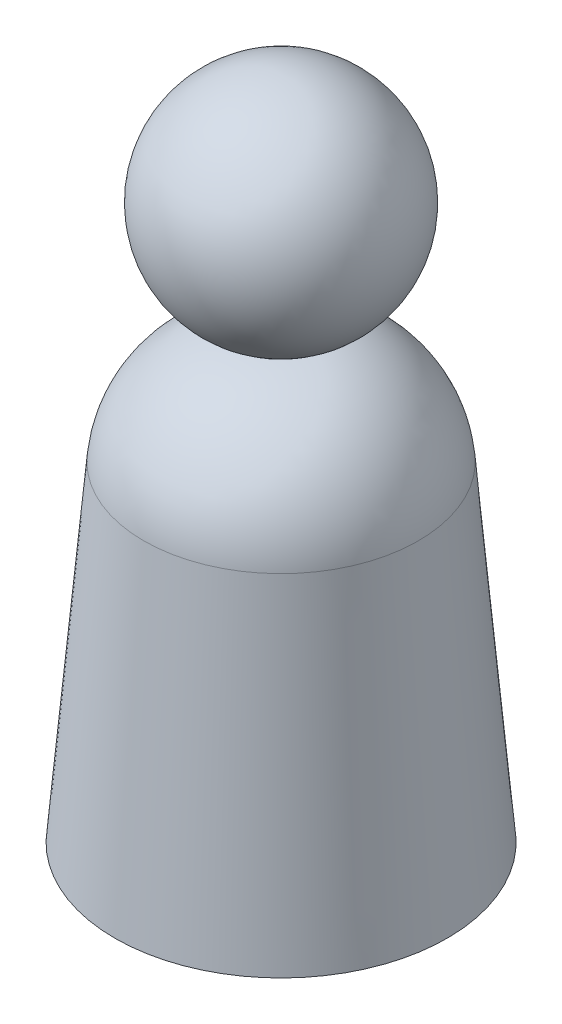
ISO-10303-21;
HEADER;
FILE_DESCRIPTION(('STEP AP214'),'2;1');
FILE_NAME('part.step','',(''),(''),'','','');
FILE_SCHEMA(('AUTOMOTIVE_DESIGN { 1 0 10303 214 1 1 1 1 }'));
ENDSEC;
DATA;
#1=APPLICATION_CONTEXT('core data for automotive mechanical design processes');
#2=APPLICATION_PROTOCOL_DEFINITION('international standard','automotive_design',2000,#1);
#3=PRODUCT_CONTEXT('',#1,'mechanical');
#4=PRODUCT('Part','Part','',(#3));
#5=PRODUCT_RELATED_PRODUCT_CATEGORY('part','',(#4));
#6=PRODUCT_DEFINITION_FORMATION('','',#4);
#7=PRODUCT_DEFINITION_CONTEXT('part definition',#1,'design');
#8=PRODUCT_DEFINITION('design','',#6,#7);
#9=PRODUCT_DEFINITION_SHAPE('','',#8);
#10=(LENGTH_UNIT() NAMED_UNIT(*) SI_UNIT(.MILLI.,.METRE.));
#11=(NAMED_UNIT(*) PLANE_ANGLE_UNIT() SI_UNIT($,.RADIAN.));
#12=(NAMED_UNIT(*) SI_UNIT($,.STERADIAN.) SOLID_ANGLE_UNIT());
#13=UNCERTAINTY_MEASURE_WITH_UNIT(LENGTH_MEASURE(1.E-05),#10,'distance_accuracy_value','');
#14=(GEOMETRIC_REPRESENTATION_CONTEXT(3) GLOBAL_UNCERTAINTY_ASSIGNED_CONTEXT((#13)) GLOBAL_UNIT_ASSIGNED_CONTEXT((#10,
#11,#12)) REPRESENTATION_CONTEXT('',''));
#15=CARTESIAN_POINT('',(0.,0.,0.));
#16=DIRECTION('',(0.,0.,1.));
#17=DIRECTION('',(1.,0.,0.));
#18=AXIS2_PLACEMENT_3D('',#15,#16,#17);
#19=CARTESIAN_POINT('',(0.,0.,0.));
#20=DIRECTION('',(0.,1.,0.));
#21=DIRECTION('',(0.,0.,-1.));
#22=AXIS2_PLACEMENT_3D('',#19,#20,#21);
#23=SPHERICAL_SURFACE('',#22,152.4);
#24=CARTESIAN_POINT('',(0.,-152.161325126103,0.));
#25=DIRECTION('',(0.,1.,0.));
#26=DIRECTION('',(0.,0.,1.));
#27=AXIS2_PLACEMENT_3D('',#24,#25,#26);
#28=CIRCLE('',#27,8.5259096798236);
#29=CARTESIAN_POINT('',(0.,-152.161325126103,8.52590967982361));
#30=VERTEX_POINT('',#29);
#31=EDGE_CURVE('E10',#30,#30,#28,.F.);
#32=ORIENTED_EDGE('',*,*,#31,.F.);
#33=EDGE_LOOP('',(#32));
#34=FACE_BOUND('',#33,.T.);
#35=ADVANCED_FACE('F33',(#34),#23,.T.);
#36=CARTESIAN_POINT('',(0.,-323.342815892968,0.));
#37=DIRECTION('',(0.,1.,0.));
#38=DIRECTION('',(0.,0.,1.));
#39=AXIS2_PLACEMENT_3D('',#36,#37,#38);
#40=DEGENERATE_TOROIDAL_SURFACE('',#39,18.1175580696251,171.45,.T.);
#41=ORIENTED_EDGE('',*,*,#31,.T.);
#42=EDGE_LOOP('',(#41));
#43=FACE_BOUND('',#42,.T.);
#44=CARTESIAN_POINT('',(0.,-308.399963798882,0.));
#45=DIRECTION('',(0.,1.,0.));
#46=DIRECTION('',(0.,0.,1.));
#47=AXIS2_PLACEMENT_3D('',#44,#45,#46);
#48=CIRCLE('',#47,188.915139057455);
#49=CARTESIAN_POINT('',(0.,-308.399963798882,188.915139057455));
#50=VERTEX_POINT('',#49);
#51=EDGE_CURVE('E39',#50,#50,#48,.T.);
#52=ORIENTED_EDGE('',*,*,#51,.T.);
#53=EDGE_LOOP('',(#52));
#54=FACE_BOUND('',#53,.T.);
#55=ADVANCED_FACE('F58',(#43,#54),#40,.T.);
#56=CARTESIAN_POINT('',(0.,-762.,0.));
#57=DIRECTION('',(0.,-1.,0.));
#58=DIRECTION('',(0.,0.,-1.));
#59=AXIS2_PLACEMENT_3D('',#56,#57,#58);
#60=CONICAL_SURFACE('',#59,228.6,0.0872664625997134);
#61=ORIENTED_EDGE('',*,*,#51,.F.);
#62=EDGE_LOOP('',(#61));
#63=FACE_BOUND('',#62,.T.);
#64=CARTESIAN_POINT('',(0.,-762.,0.));
#65=DIRECTION('',(0.,1.,0.));
#66=DIRECTION('',(0.,0.,1.));
#67=AXIS2_PLACEMENT_3D('',#64,#65,#66);
#68=CIRCLE('',#67,228.6);
#69=CARTESIAN_POINT('',(0.,-762.,228.6));
#70=VERTEX_POINT('',#69);
#71=EDGE_CURVE('E43',#70,#70,#68,.T.);
#72=ORIENTED_EDGE('',*,*,#71,.T.);
#73=EDGE_LOOP('',(#72));
#74=FACE_BOUND('',#73,.T.);
#75=ADVANCED_FACE('F50',(#63,#74),#60,.T.);
#76=CARTESIAN_POINT('',(0.,-762.,0.));
#77=DIRECTION('',(0.,1.,0.));
#78=DIRECTION('',(0.,0.,1.));
#79=AXIS2_PLACEMENT_3D('',#76,#77,#78);
#80=PLANE('',#79);
#81=ORIENTED_EDGE('',*,*,#71,.F.);
#82=EDGE_LOOP('',(#81));
#83=FACE_BOUND('',#82,.T.);
#84=ADVANCED_FACE('F52',(#83),#80,.F.);
#85=CLOSED_SHELL('',(#35,#55,#75,#84));
#86=MANIFOLD_SOLID_BREP('B2',#85);
#87=ADVANCED_BREP_SHAPE_REPRESENTATION('',(#18,#86),#14);
#88=SHAPE_DEFINITION_REPRESENTATION(#9,#87);
ENDSEC;
END-ISO-10303-21;
